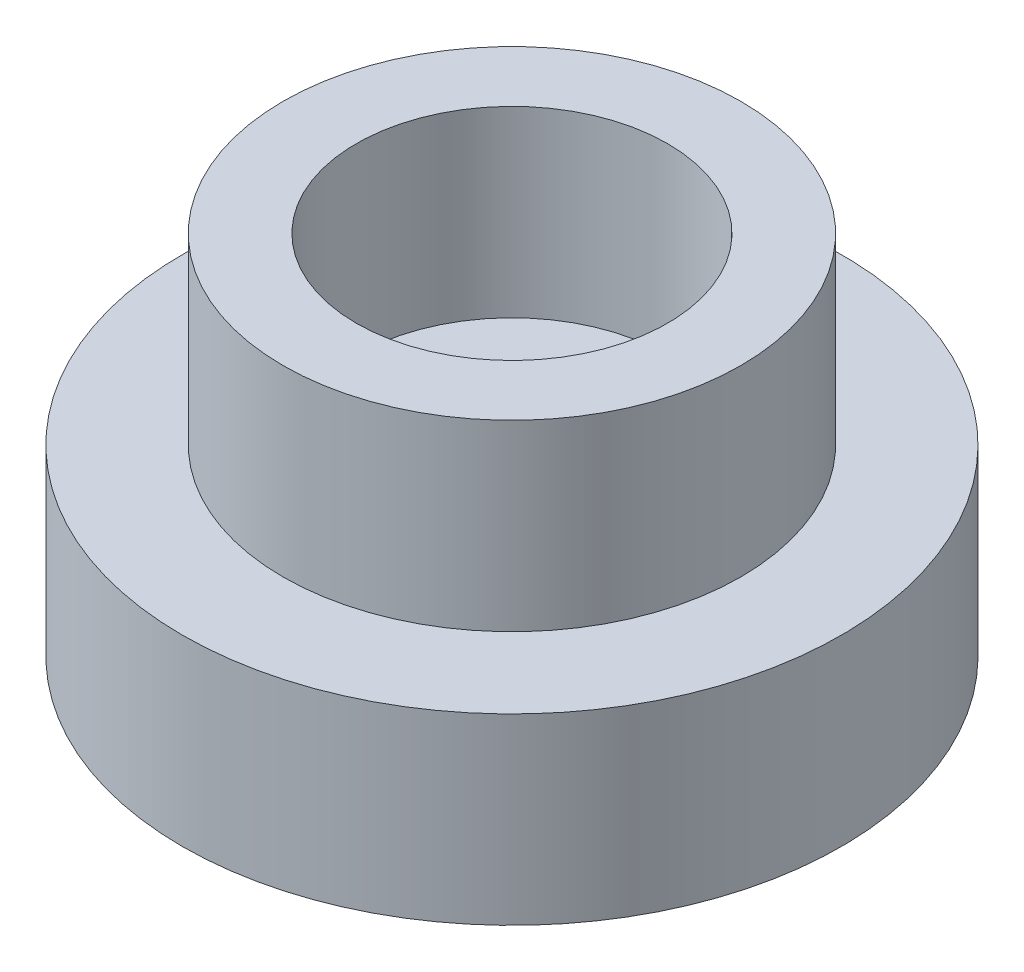
ISO-10303-21;
HEADER;
FILE_DESCRIPTION(('STEP AP214'),'2;1');
FILE_NAME('part.step','',(''),(''),'','','');
FILE_SCHEMA(('AUTOMOTIVE_DESIGN { 1 0 10303 214 1 1 1 1 }'));
ENDSEC;
DATA;
#1=APPLICATION_CONTEXT('core data for automotive mechanical design processes');
#2=APPLICATION_PROTOCOL_DEFINITION('international standard','automotive_design',2000,#1);
#3=PRODUCT_CONTEXT('',#1,'mechanical');
#4=PRODUCT('Part','Part','',(#3));
#5=PRODUCT_RELATED_PRODUCT_CATEGORY('part','',(#4));
#6=PRODUCT_DEFINITION_FORMATION('','',#4);
#7=PRODUCT_DEFINITION_CONTEXT('part definition',#1,'design');
#8=PRODUCT_DEFINITION('design','',#6,#7);
#9=PRODUCT_DEFINITION_SHAPE('','',#8);
#10=(LENGTH_UNIT() NAMED_UNIT(*) SI_UNIT(.MILLI.,.METRE.));
#11=(NAMED_UNIT(*) PLANE_ANGLE_UNIT() SI_UNIT($,.RADIAN.));
#12=(NAMED_UNIT(*) SI_UNIT($,.STERADIAN.) SOLID_ANGLE_UNIT());
#13=UNCERTAINTY_MEASURE_WITH_UNIT(LENGTH_MEASURE(1.E-05),#10,'distance_accuracy_value','');
#14=(GEOMETRIC_REPRESENTATION_CONTEXT(3) GLOBAL_UNCERTAINTY_ASSIGNED_CONTEXT((#13)) GLOBAL_UNIT_ASSIGNED_CONTEXT((#10,
#11,#12)) REPRESENTATION_CONTEXT('',''));
#15=CARTESIAN_POINT('',(0.,0.,0.));
#16=DIRECTION('',(0.,0.,1.));
#17=DIRECTION('',(1.,0.,0.));
#18=AXIS2_PLACEMENT_3D('',#15,#16,#17);
#19=CARTESIAN_POINT('',(0.,5.,0.));
#20=DIRECTION('',(0.,-1.,0.));
#21=DIRECTION('',(0.,0.,-1.));
#22=AXIS2_PLACEMENT_3D('',#19,#20,#21);
#23=CYLINDRICAL_SURFACE('',#22,9.);
#24=CARTESIAN_POINT('',(0.,5.,0.));
#25=DIRECTION('',(0.,1.,0.));
#26=DIRECTION('',(0.,0.,1.));
#27=AXIS2_PLACEMENT_3D('',#24,#25,#26);
#28=CIRCLE('',#27,9.);
#29=CARTESIAN_POINT('',(0.,5.,9.));
#30=VERTEX_POINT('',#29);
#31=EDGE_CURVE('E54',#30,#30,#28,.T.);
#32=ORIENTED_EDGE('',*,*,#31,.F.);
#33=EDGE_LOOP('',(#32));
#34=FACE_BOUND('',#33,.T.);
#35=CARTESIAN_POINT('',(0.,0.,0.));
#36=DIRECTION('',(0.,1.,0.));
#37=DIRECTION('',(0.,0.,1.));
#38=AXIS2_PLACEMENT_3D('',#35,#36,#37);
#39=CIRCLE('',#38,9.);
#40=CARTESIAN_POINT('',(0.,0.,9.));
#41=VERTEX_POINT('',#40);
#42=EDGE_CURVE('E59',#41,#41,#39,.T.);
#43=ORIENTED_EDGE('',*,*,#42,.T.);
#44=EDGE_LOOP('',(#43));
#45=FACE_BOUND('',#44,.T.);
#46=ADVANCED_FACE('F47',(#34,#45),#23,.T.);
#47=CARTESIAN_POINT('',(0.,5.,0.));
#48=DIRECTION('',(0.,1.,0.));
#49=DIRECTION('',(0.,0.,1.));
#50=AXIS2_PLACEMENT_3D('',#47,#48,#49);
#51=PLANE('',#50);
#52=CARTESIAN_POINT('',(0.,5.,0.));
#53=DIRECTION('',(0.,1.,0.));
#54=DIRECTION('',(0.,0.,1.));
#55=AXIS2_PLACEMENT_3D('',#52,#53,#54);
#56=CIRCLE('',#55,6.25);
#57=CARTESIAN_POINT('',(0.,5.,6.25));
#58=VERTEX_POINT('',#57);
#59=EDGE_CURVE('E67',#58,#58,#56,.T.);
#60=ORIENTED_EDGE('',*,*,#59,.F.);
#61=EDGE_LOOP('',(#60));
#62=FACE_BOUND('',#61,.T.);
#63=ORIENTED_EDGE('',*,*,#31,.T.);
#64=EDGE_LOOP('',(#63));
#65=FACE_BOUND('',#64,.T.);
#66=ADVANCED_FACE('F93',(#62,#65),#51,.T.);
#67=CARTESIAN_POINT('',(0.,0.,0.));
#68=DIRECTION('',(0.,1.,0.));
#69=DIRECTION('',(0.,0.,1.));
#70=AXIS2_PLACEMENT_3D('',#67,#68,#69);
#71=PLANE('',#70);
#72=ORIENTED_EDGE('',*,*,#42,.F.);
#73=EDGE_LOOP('',(#72));
#74=FACE_BOUND('',#73,.T.);
#75=ADVANCED_FACE('F84',(#74),#71,.F.);
#76=CARTESIAN_POINT('',(0.,10.,0.));
#77=DIRECTION('',(0.,1.,0.));
#78=DIRECTION('',(0.,0.,1.));
#79=AXIS2_PLACEMENT_3D('',#76,#77,#78);
#80=PLANE('',#79);
#81=CARTESIAN_POINT('',(0.,10.,0.));
#82=DIRECTION('',(0.,1.,0.));
#83=DIRECTION('',(0.,0.,1.));
#84=AXIS2_PLACEMENT_3D('',#81,#82,#83);
#85=CIRCLE('',#84,6.25);
#86=CARTESIAN_POINT('',(0.,10.,6.25));
#87=VERTEX_POINT('',#86);
#88=EDGE_CURVE('E65',#87,#87,#85,.T.);
#89=ORIENTED_EDGE('',*,*,#88,.T.);
#90=EDGE_LOOP('',(#89));
#91=FACE_BOUND('',#90,.T.);
#92=CARTESIAN_POINT('',(0.,10.,0.));
#93=DIRECTION('',(0.,1.,0.));
#94=DIRECTION('',(0.,0.,1.));
#95=AXIS2_PLACEMENT_3D('',#92,#93,#94);
#96=CIRCLE('',#95,4.25);
#97=CARTESIAN_POINT('',(0.,10.,4.25));
#98=VERTEX_POINT('',#97);
#99=EDGE_CURVE('E71',#98,#98,#96,.T.);
#100=ORIENTED_EDGE('',*,*,#99,.F.);
#101=EDGE_LOOP('',(#100));
#102=FACE_BOUND('',#101,.T.);
#103=ADVANCED_FACE('F81',(#91,#102),#80,.T.);
#104=CARTESIAN_POINT('',(0.,10.,0.));
#105=DIRECTION('',(0.,-1.,0.));
#106=DIRECTION('',(0.,0.,-1.));
#107=AXIS2_PLACEMENT_3D('',#104,#105,#106);
#108=CYLINDRICAL_SURFACE('',#107,6.25);
#109=ORIENTED_EDGE('',*,*,#88,.F.);
#110=EDGE_LOOP('',(#109));
#111=FACE_BOUND('',#110,.T.);
#112=ORIENTED_EDGE('',*,*,#59,.T.);
#113=EDGE_LOOP('',(#112));
#114=FACE_BOUND('',#113,.T.);
#115=ADVANCED_FACE('F83',(#111,#114),#108,.T.);
#116=CARTESIAN_POINT('',(0.,10.,0.));
#117=DIRECTION('',(0.,-1.,0.));
#118=DIRECTION('',(0.,0.,-1.));
#119=AXIS2_PLACEMENT_3D('',#116,#117,#118);
#120=CYLINDRICAL_SURFACE('',#119,4.25);
#121=ORIENTED_EDGE('',*,*,#99,.T.);
#122=EDGE_LOOP('',(#121));
#123=FACE_BOUND('',#122,.T.);
#124=CARTESIAN_POINT('',(0.,5.,0.));
#125=DIRECTION('',(0.,1.,0.));
#126=DIRECTION('',(0.,0.,1.));
#127=AXIS2_PLACEMENT_3D('',#124,#125,#126);
#128=CIRCLE('',#127,4.25);
#129=CARTESIAN_POINT('',(0.,5.,4.25));
#130=VERTEX_POINT('',#129);
#131=EDGE_CURVE('E11',#130,#130,#128,.F.);
#132=ORIENTED_EDGE('',*,*,#131,.T.);
#133=EDGE_LOOP('',(#132));
#134=FACE_BOUND('',#133,.T.);
#135=ADVANCED_FACE('F79',(#123,#134),#120,.F.);
#136=ORIENTED_EDGE('',*,*,#131,.F.);
#137=EDGE_LOOP('',(#136));
#138=FACE_BOUND('',#137,.T.);
#139=ADVANCED_FACE('F103',(#138),#51,.T.);
#140=CLOSED_SHELL('',(#46,#66,#75,#103,#115,#135,#139));
#141=MANIFOLD_SOLID_BREP('B2',#140);
#142=ADVANCED_BREP_SHAPE_REPRESENTATION('',(#18,#141),#14);
#143=SHAPE_DEFINITION_REPRESENTATION(#9,#142);
ENDSEC;
END-ISO-10303-21;
